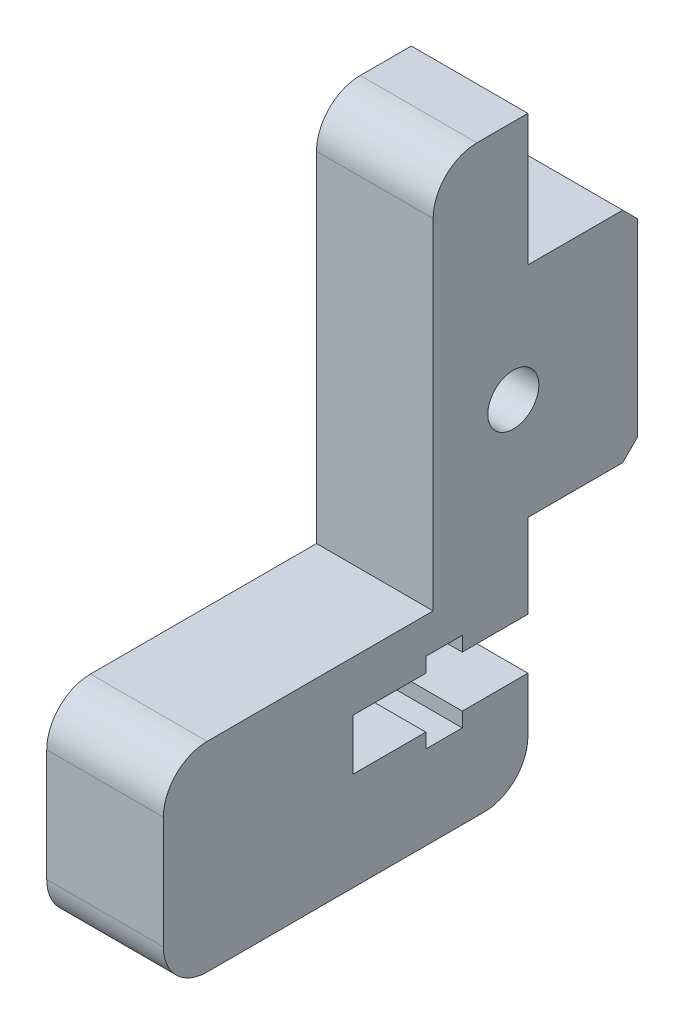
ISO-10303-21;
HEADER;
FILE_DESCRIPTION(('STEP AP214'),'2;1');
FILE_NAME('part.step','',(''),(''),'','','');
FILE_SCHEMA(('AUTOMOTIVE_DESIGN { 1 0 10303 214 1 1 1 1 }'));
ENDSEC;
DATA;
#1=APPLICATION_CONTEXT('core data for automotive mechanical design processes');
#2=APPLICATION_PROTOCOL_DEFINITION('international standard','automotive_design',2000,#1);
#3=PRODUCT_CONTEXT('',#1,'mechanical');
#4=PRODUCT('Part','Part','',(#3));
#5=PRODUCT_RELATED_PRODUCT_CATEGORY('part','',(#4));
#6=PRODUCT_DEFINITION_FORMATION('','',#4);
#7=PRODUCT_DEFINITION_CONTEXT('part definition',#1,'design');
#8=PRODUCT_DEFINITION('design','',#6,#7);
#9=PRODUCT_DEFINITION_SHAPE('','',#8);
#10=(LENGTH_UNIT() NAMED_UNIT(*) SI_UNIT(.MILLI.,.METRE.));
#11=(NAMED_UNIT(*) PLANE_ANGLE_UNIT() SI_UNIT($,.RADIAN.));
#12=(NAMED_UNIT(*) SI_UNIT($,.STERADIAN.) SOLID_ANGLE_UNIT());
#13=UNCERTAINTY_MEASURE_WITH_UNIT(LENGTH_MEASURE(1.E-05),#10,'distance_accuracy_value','');
#14=(GEOMETRIC_REPRESENTATION_CONTEXT(3) GLOBAL_UNCERTAINTY_ASSIGNED_CONTEXT((#13)) GLOBAL_UNIT_ASSIGNED_CONTEXT((#10,
#11,#12)) REPRESENTATION_CONTEXT('',''));
#15=CARTESIAN_POINT('',(0.,0.,0.));
#16=DIRECTION('',(0.,0.,1.));
#17=DIRECTION('',(1.,0.,0.));
#18=AXIS2_PLACEMENT_3D('',#15,#16,#17);
#19=CARTESIAN_POINT('',(8.,40.0972170023576,-24.582940187531));
#20=DIRECTION('',(1.,0.,0.));
#21=DIRECTION('',(0.,0.,-1.));
#22=AXIS2_PLACEMENT_3D('',#19,#20,#21);
#23=PLANE('',#22);
#24=DIRECTION('',(0.,1.,0.));
#25=VECTOR('',#24,1.);
#26=CARTESIAN_POINT('',(8.,13.3472170023576,-28.082940187531));
#27=LINE('',#26,#25);
#28=CARTESIAN_POINT('',(8.,13.3472170023576,-28.082940187531));
#29=VERTEX_POINT('',#28);
#30=CARTESIAN_POINT('',(8.,19.0972170023576,-28.082940187531));
#31=VERTEX_POINT('',#30);
#32=EDGE_CURVE('E309',#29,#31,#27,.T.);
#33=ORIENTED_EDGE('',*,*,#32,.T.);
#34=DIRECTION('',(0.,0.,-1.));
#35=VECTOR('',#34,1.);
#36=CARTESIAN_POINT('',(8.,19.0972170023576,-28.082940187531));
#37=LINE('',#36,#35);
#38=CARTESIAN_POINT('',(8.,19.0972170023576,-34.582940187531));
#39=VERTEX_POINT('',#38);
#40=EDGE_CURVE('E157',#31,#39,#37,.T.);
#41=ORIENTED_EDGE('',*,*,#40,.T.);
#42=DIRECTION('',(0.,0.707106781186549,-0.707106781186546));
#43=VECTOR('',#42,1.);
#44=CARTESIAN_POINT('',(8.,19.0972170023576,-34.582940187531));
#45=LINE('',#44,#43);
#46=CARTESIAN_POINT('',(8.,20.0972170023576,-35.582940187531));
#47=VERTEX_POINT('',#46);
#48=EDGE_CURVE('E384',#39,#47,#45,.T.);
#49=ORIENTED_EDGE('',*,*,#48,.T.);
#50=DIRECTION('',(0.,1.,0.));
#51=VECTOR('',#50,1.);
#52=CARTESIAN_POINT('',(8.,20.0972170023576,-35.582940187531));
#53=LINE('',#52,#51);
#54=CARTESIAN_POINT('',(8.,33.0972170023576,-35.582940187531));
#55=VERTEX_POINT('',#54);
#56=EDGE_CURVE('E403',#47,#55,#53,.T.);
#57=ORIENTED_EDGE('',*,*,#56,.T.);
#58=DIRECTION('',(0.,0.707106781186547,0.707106781186547));
#59=VECTOR('',#58,1.);
#60=CARTESIAN_POINT('',(8.,33.0972170023576,-35.582940187531));
#61=LINE('',#60,#59);
#62=CARTESIAN_POINT('',(8.,34.0972170023576,-34.582940187531));
#63=VERTEX_POINT('',#62);
#64=EDGE_CURVE('E400',#55,#63,#61,.T.);
#65=ORIENTED_EDGE('',*,*,#64,.T.);
#66=DIRECTION('',(0.,0.,1.));
#67=VECTOR('',#66,1.);
#68=CARTESIAN_POINT('',(8.,34.0972170023576,-34.582940187531));
#69=LINE('',#68,#67);
#70=CARTESIAN_POINT('',(8.,34.0972170023576,-28.082940187531));
#71=VERTEX_POINT('',#70);
#72=EDGE_CURVE('E402',#63,#71,#69,.T.);
#73=ORIENTED_EDGE('',*,*,#72,.T.);
#74=DIRECTION('',(0.,1.,0.));
#75=VECTOR('',#74,1.);
#76=CARTESIAN_POINT('',(8.,34.0972170023576,-28.082940187531));
#77=LINE('',#76,#75);
#78=CARTESIAN_POINT('',(8.,43.0972170023576,-28.082940187531));
#79=VERTEX_POINT('',#78);
#80=EDGE_CURVE('E405',#71,#79,#77,.T.);
#81=ORIENTED_EDGE('',*,*,#80,.T.);
#82=DIRECTION('',(0.,0.,1.));
#83=VECTOR('',#82,1.);
#84=CARTESIAN_POINT('',(8.,43.0972170023576,-28.082940187531));
#85=LINE('',#84,#83);
#86=CARTESIAN_POINT('',(8.,43.0972170023576,-24.582940187531));
#87=VERTEX_POINT('',#86);
#88=EDGE_CURVE('E411',#79,#87,#85,.T.);
#89=ORIENTED_EDGE('',*,*,#88,.T.);
#90=CARTESIAN_POINT('',(8.,40.0972170023576,-24.582940187531));
#91=DIRECTION('',(1.,0.,0.));
#92=DIRECTION('',(0.,0.,-1.));
#93=AXIS2_PLACEMENT_3D('',#90,#91,#92);
#94=CIRCLE('',#93,3.);
#95=CARTESIAN_POINT('',(8.,40.0972170023576,-21.582940187531));
#96=VERTEX_POINT('',#95);
#97=EDGE_CURVE('E413',#87,#96,#94,.T.);
#98=ORIENTED_EDGE('',*,*,#97,.T.);
#99=DIRECTION('',(0.,-1.,0.));
#100=VECTOR('',#99,1.);
#101=CARTESIAN_POINT('',(8.,40.0972170023576,-21.582940187531));
#102=LINE('',#101,#100);
#103=CARTESIAN_POINT('',(8.,16.7972170023578,-21.582940187531));
#104=VERTEX_POINT('',#103);
#105=EDGE_CURVE('E415',#96,#104,#102,.T.);
#106=ORIENTED_EDGE('',*,*,#105,.T.);
#107=DIRECTION('',(0.,0.,1.));
#108=VECTOR('',#107,1.);
#109=CARTESIAN_POINT('',(8.,16.7972170023578,-21.582940187531));
#110=LINE('',#109,#108);
#111=CARTESIAN_POINT('',(8.,16.7972170023578,-6.08294018753095));
#112=VERTEX_POINT('',#111);
#113=EDGE_CURVE('E417',#104,#112,#110,.T.);
#114=ORIENTED_EDGE('',*,*,#113,.T.);
#115=CARTESIAN_POINT('',(8.,13.7972170023578,-6.08294018753095));
#116=DIRECTION('',(1.,0.,0.));
#117=DIRECTION('',(0.,0.,-1.));
#118=AXIS2_PLACEMENT_3D('',#115,#116,#117);
#119=CIRCLE('',#118,3.);
#120=CARTESIAN_POINT('',(8.,13.7972170023578,-3.08294018753095));
#121=VERTEX_POINT('',#120);
#122=EDGE_CURVE('E419',#112,#121,#119,.T.);
#123=ORIENTED_EDGE('',*,*,#122,.T.);
#124=DIRECTION('',(0.,-1.,0.));
#125=VECTOR('',#124,1.);
#126=CARTESIAN_POINT('',(8.,13.7972170023578,-3.08294018753095));
#127=LINE('',#126,#125);
#128=CARTESIAN_POINT('',(8.,6.09721700235757,-3.08294018753095));
#129=VERTEX_POINT('',#128);
#130=EDGE_CURVE('E421',#121,#129,#127,.T.);
#131=ORIENTED_EDGE('',*,*,#130,.T.);
#132=CARTESIAN_POINT('',(8.,6.09721700235758,-6.08294018753095));
#133=DIRECTION('',(1.,0.,0.));
#134=DIRECTION('',(0.,0.,-1.));
#135=AXIS2_PLACEMENT_3D('',#132,#133,#134);
#136=CIRCLE('',#135,3.);
#137=CARTESIAN_POINT('',(8.,3.09721700235757,-6.08294018753095));
#138=VERTEX_POINT('',#137);
#139=EDGE_CURVE('E423',#129,#138,#136,.T.);
#140=ORIENTED_EDGE('',*,*,#139,.T.);
#141=DIRECTION('',(0.,0.,-1.));
#142=VECTOR('',#141,1.);
#143=CARTESIAN_POINT('',(8.,3.09721700235757,-6.08294018753095));
#144=LINE('',#143,#142);
#145=CARTESIAN_POINT('',(8.,3.09721700235757,-25.082940187531));
#146=VERTEX_POINT('',#145);
#147=EDGE_CURVE('E425',#138,#146,#144,.T.);
#148=ORIENTED_EDGE('',*,*,#147,.T.);
#149=CARTESIAN_POINT('',(8.,6.09721700235758,-25.082940187531));
#150=DIRECTION('',(1.,0.,0.));
#151=DIRECTION('',(0.,0.,-1.));
#152=AXIS2_PLACEMENT_3D('',#149,#150,#151);
#153=CIRCLE('',#152,3.);
#154=CARTESIAN_POINT('',(8.,6.09721700235757,-28.082940187531));
#155=VERTEX_POINT('',#154);
#156=EDGE_CURVE('E427',#146,#155,#153,.T.);
#157=ORIENTED_EDGE('',*,*,#156,.T.);
#158=DIRECTION('',(0.,1.,0.));
#159=VECTOR('',#158,1.);
#160=CARTESIAN_POINT('',(8.,6.09721700235757,-28.082940187531));
#161=LINE('',#160,#159);
#162=CARTESIAN_POINT('',(8.,9.84721700235757,-28.082940187531));
#163=VERTEX_POINT('',#162);
#164=EDGE_CURVE('E429',#155,#163,#161,.T.);
#165=ORIENTED_EDGE('',*,*,#164,.T.);
#166=DIRECTION('',(0.,0.,1.));
#167=VECTOR('',#166,1.);
#168=CARTESIAN_POINT('',(8.,9.84721700235757,-28.082940187531));
#169=LINE('',#168,#167);
#170=CARTESIAN_POINT('',(8.,9.84721700235757,-23.582940187531));
#171=VERTEX_POINT('',#170);
#172=EDGE_CURVE('E431',#163,#171,#169,.T.);
#173=ORIENTED_EDGE('',*,*,#172,.T.);
#174=DIRECTION('',(0.,-1.,0.));
#175=VECTOR('',#174,1.);
#176=CARTESIAN_POINT('',(8.,9.84721700235757,-23.582940187531));
#177=LINE('',#176,#175);
#178=CARTESIAN_POINT('',(8.,8.84721700235758,-23.582940187531));
#179=VERTEX_POINT('',#178);
#180=EDGE_CURVE('E433',#171,#179,#177,.T.);
#181=ORIENTED_EDGE('',*,*,#180,.T.);
#182=DIRECTION('',(0.,0.,1.));
#183=VECTOR('',#182,1.);
#184=CARTESIAN_POINT('',(8.,8.84721700235758,-23.582940187531));
#185=LINE('',#184,#183);
#186=CARTESIAN_POINT('',(8.,8.84721700235758,-21.082940187531));
#187=VERTEX_POINT('',#186);
#188=EDGE_CURVE('E435',#179,#187,#185,.T.);
#189=ORIENTED_EDGE('',*,*,#188,.T.);
#190=DIRECTION('',(0.,1.,0.));
#191=VECTOR('',#190,1.);
#192=CARTESIAN_POINT('',(8.,8.84721700235758,-21.082940187531));
#193=LINE('',#192,#191);
#194=CARTESIAN_POINT('',(8.,9.84721700235757,-21.082940187531));
#195=VERTEX_POINT('',#194);
#196=EDGE_CURVE('E437',#187,#195,#193,.T.);
#197=ORIENTED_EDGE('',*,*,#196,.T.);
#198=DIRECTION('',(0.,0.,1.));
#199=VECTOR('',#198,1.);
#200=CARTESIAN_POINT('',(8.,9.84721700235757,-21.082940187531));
#201=LINE('',#200,#199);
#202=CARTESIAN_POINT('',(8.,9.84721700235757,-16.082940187531));
#203=VERTEX_POINT('',#202);
#204=EDGE_CURVE('E439',#195,#203,#201,.T.);
#205=ORIENTED_EDGE('',*,*,#204,.T.);
#206=DIRECTION('',(0.,1.,0.));
#207=VECTOR('',#206,1.);
#208=CARTESIAN_POINT('',(8.,9.84721700235757,-16.082940187531));
#209=LINE('',#208,#207);
#210=CARTESIAN_POINT('',(8.,13.3472170023576,-16.082940187531));
#211=VERTEX_POINT('',#210);
#212=EDGE_CURVE('E441',#203,#211,#209,.T.);
#213=ORIENTED_EDGE('',*,*,#212,.T.);
#214=DIRECTION('',(0.,0.,-1.));
#215=VECTOR('',#214,1.);
#216=CARTESIAN_POINT('',(8.,13.3472170023576,-16.082940187531));
#217=LINE('',#216,#215);
#218=CARTESIAN_POINT('',(8.,13.3472170023576,-21.082940187531));
#219=VERTEX_POINT('',#218);
#220=EDGE_CURVE('E443',#211,#219,#217,.T.);
#221=ORIENTED_EDGE('',*,*,#220,.T.);
#222=DIRECTION('',(0.,1.,0.));
#223=VECTOR('',#222,1.);
#224=CARTESIAN_POINT('',(8.,13.3472170023576,-21.082940187531));
#225=LINE('',#224,#223);
#226=CARTESIAN_POINT('',(8.,14.3472170023576,-21.082940187531));
#227=VERTEX_POINT('',#226);
#228=EDGE_CURVE('E236',#219,#227,#225,.T.);
#229=ORIENTED_EDGE('',*,*,#228,.T.);
#230=DIRECTION('',(0.,0.,-1.));
#231=VECTOR('',#230,1.);
#232=CARTESIAN_POINT('',(8.,14.3472170023576,-21.082940187531));
#233=LINE('',#232,#231);
#234=CARTESIAN_POINT('',(8.,14.3472170023576,-23.582940187531));
#235=VERTEX_POINT('',#234);
#236=EDGE_CURVE('E230',#227,#235,#233,.T.);
#237=ORIENTED_EDGE('',*,*,#236,.T.);
#238=DIRECTION('',(0.,-1.,0.));
#239=VECTOR('',#238,1.);
#240=CARTESIAN_POINT('',(8.,14.3472170023576,-23.582940187531));
#241=LINE('',#240,#239);
#242=CARTESIAN_POINT('',(8.,13.3472170023576,-23.582940187531));
#243=VERTEX_POINT('',#242);
#244=EDGE_CURVE('E234',#235,#243,#241,.T.);
#245=ORIENTED_EDGE('',*,*,#244,.T.);
#246=DIRECTION('',(0.,0.,-1.));
#247=VECTOR('',#246,1.);
#248=CARTESIAN_POINT('',(8.,13.3472170023576,-23.582940187531));
#249=LINE('',#248,#247);
#250=EDGE_CURVE('E54',#243,#29,#249,.T.);
#251=ORIENTED_EDGE('',*,*,#250,.T.);
#252=EDGE_LOOP('',(#33,#41,#49,#57,#65,#73,#81,#89,#98,#106,#114,#123,#131,#140,#148,#157,#165,
#173,#181,#189,#197,#205,#213,#221,#229,#237,#245,#251));
#253=FACE_BOUND('',#252,.T.);
#254=CARTESIAN_POINT('',(8.,26.5972170023576,-27.082940187531));
#255=DIRECTION('',(1.,0.,0.));
#256=DIRECTION('',(0.,0.,-1.));
#257=AXIS2_PLACEMENT_3D('',#254,#255,#256);
#258=CIRCLE('',#257,1.75);
#259=CARTESIAN_POINT('',(8.,26.5972170023576,-28.832940187531));
#260=VERTEX_POINT('',#259);
#261=EDGE_CURVE('E258',#260,#260,#258,.T.);
#262=ORIENTED_EDGE('',*,*,#261,.F.);
#263=EDGE_LOOP('',(#262));
#264=FACE_BOUND('',#263,.T.);
#265=ADVANCED_FACE('F37',(#253,#264),#23,.T.);
#266=CARTESIAN_POINT('',(0.,40.0972170023576,-24.582940187531));
#267=DIRECTION('',(1.,0.,0.));
#268=DIRECTION('',(0.,0.,-1.));
#269=AXIS2_PLACEMENT_3D('',#266,#267,#268);
#270=PLANE('',#269);
#271=DIRECTION('',(0.,1.,0.));
#272=VECTOR('',#271,1.);
#273=CARTESIAN_POINT('',(0.,13.3472170023576,-28.082940187531));
#274=LINE('',#273,#272);
#275=CARTESIAN_POINT('',(0.,13.3472170023576,-28.082940187531));
#276=VERTEX_POINT('',#275);
#277=CARTESIAN_POINT('',(0.,19.0972170023576,-28.082940187531));
#278=VERTEX_POINT('',#277);
#279=EDGE_CURVE('E254',#276,#278,#274,.T.);
#280=ORIENTED_EDGE('',*,*,#279,.F.);
#281=DIRECTION('',(0.,0.,-1.));
#282=VECTOR('',#281,1.);
#283=CARTESIAN_POINT('',(0.,13.3472170023576,-23.582940187531));
#284=LINE('',#283,#282);
#285=CARTESIAN_POINT('',(0.,13.3472170023576,-23.582940187531));
#286=VERTEX_POINT('',#285);
#287=EDGE_CURVE('E149',#286,#276,#284,.T.);
#288=ORIENTED_EDGE('',*,*,#287,.F.);
#289=DIRECTION('',(0.,-1.,0.));
#290=VECTOR('',#289,1.);
#291=CARTESIAN_POINT('',(0.,14.3472170023576,-23.582940187531));
#292=LINE('',#291,#290);
#293=CARTESIAN_POINT('',(0.,14.3472170023576,-23.582940187531));
#294=VERTEX_POINT('',#293);
#295=EDGE_CURVE('E143',#294,#286,#292,.T.);
#296=ORIENTED_EDGE('',*,*,#295,.F.);
#297=DIRECTION('',(0.,0.,-1.));
#298=VECTOR('',#297,1.);
#299=CARTESIAN_POINT('',(0.,14.3472170023576,-21.082940187531));
#300=LINE('',#299,#298);
#301=CARTESIAN_POINT('',(0.,14.3472170023576,-21.082940187531));
#302=VERTEX_POINT('',#301);
#303=EDGE_CURVE('E244',#302,#294,#300,.T.);
#304=ORIENTED_EDGE('',*,*,#303,.F.);
#305=DIRECTION('',(0.,1.,0.));
#306=VECTOR('',#305,1.);
#307=CARTESIAN_POINT('',(0.,13.3472170023576,-21.082940187531));
#308=LINE('',#307,#306);
#309=CARTESIAN_POINT('',(0.,13.3472170023576,-21.082940187531));
#310=VERTEX_POINT('',#309);
#311=EDGE_CURVE('E304',#310,#302,#308,.T.);
#312=ORIENTED_EDGE('',*,*,#311,.F.);
#313=DIRECTION('',(0.,0.,-1.));
#314=VECTOR('',#313,1.);
#315=CARTESIAN_POINT('',(0.,13.3472170023576,-16.082940187531));
#316=LINE('',#315,#314);
#317=CARTESIAN_POINT('',(0.,13.3472170023576,-16.082940187531));
#318=VERTEX_POINT('',#317);
#319=EDGE_CURVE('E302',#318,#310,#316,.T.);
#320=ORIENTED_EDGE('',*,*,#319,.F.);
#321=DIRECTION('',(0.,1.,0.));
#322=VECTOR('',#321,1.);
#323=CARTESIAN_POINT('',(0.,9.84721700235757,-16.082940187531));
#324=LINE('',#323,#322);
#325=CARTESIAN_POINT('',(0.,9.84721700235757,-16.082940187531));
#326=VERTEX_POINT('',#325);
#327=EDGE_CURVE('E300',#326,#318,#324,.T.);
#328=ORIENTED_EDGE('',*,*,#327,.F.);
#329=DIRECTION('',(0.,0.,1.));
#330=VECTOR('',#329,1.);
#331=CARTESIAN_POINT('',(0.,9.84721700235757,-21.082940187531));
#332=LINE('',#331,#330);
#333=CARTESIAN_POINT('',(0.,9.84721700235757,-21.082940187531));
#334=VERTEX_POINT('',#333);
#335=EDGE_CURVE('E298',#334,#326,#332,.T.);
#336=ORIENTED_EDGE('',*,*,#335,.F.);
#337=DIRECTION('',(0.,1.,0.));
#338=VECTOR('',#337,1.);
#339=CARTESIAN_POINT('',(0.,8.84721700235758,-21.082940187531));
#340=LINE('',#339,#338);
#341=CARTESIAN_POINT('',(0.,8.84721700235758,-21.082940187531));
#342=VERTEX_POINT('',#341);
#343=EDGE_CURVE('E296',#342,#334,#340,.T.);
#344=ORIENTED_EDGE('',*,*,#343,.F.);
#345=DIRECTION('',(0.,0.,1.));
#346=VECTOR('',#345,1.);
#347=CARTESIAN_POINT('',(0.,8.84721700235758,-23.582940187531));
#348=LINE('',#347,#346);
#349=CARTESIAN_POINT('',(0.,8.84721700235758,-23.582940187531));
#350=VERTEX_POINT('',#349);
#351=EDGE_CURVE('E294',#350,#342,#348,.T.);
#352=ORIENTED_EDGE('',*,*,#351,.F.);
#353=DIRECTION('',(0.,-1.,0.));
#354=VECTOR('',#353,1.);
#355=CARTESIAN_POINT('',(0.,9.84721700235757,-23.582940187531));
#356=LINE('',#355,#354);
#357=CARTESIAN_POINT('',(0.,9.84721700235757,-23.582940187531));
#358=VERTEX_POINT('',#357);
#359=EDGE_CURVE('E292',#358,#350,#356,.T.);
#360=ORIENTED_EDGE('',*,*,#359,.F.);
#361=DIRECTION('',(0.,0.,1.));
#362=VECTOR('',#361,1.);
#363=CARTESIAN_POINT('',(0.,9.84721700235757,-28.082940187531));
#364=LINE('',#363,#362);
#365=CARTESIAN_POINT('',(0.,9.84721700235757,-28.082940187531));
#366=VERTEX_POINT('',#365);
#367=EDGE_CURVE('E290',#366,#358,#364,.T.);
#368=ORIENTED_EDGE('',*,*,#367,.F.);
#369=DIRECTION('',(0.,1.,0.));
#370=VECTOR('',#369,1.);
#371=CARTESIAN_POINT('',(0.,6.09721700235757,-28.082940187531));
#372=LINE('',#371,#370);
#373=CARTESIAN_POINT('',(0.,6.09721700235757,-28.082940187531));
#374=VERTEX_POINT('',#373);
#375=EDGE_CURVE('E288',#374,#366,#372,.T.);
#376=ORIENTED_EDGE('',*,*,#375,.F.);
#377=CARTESIAN_POINT('',(0.,6.09721700235758,-25.082940187531));
#378=DIRECTION('',(1.,0.,0.));
#379=DIRECTION('',(0.,0.,-1.));
#380=AXIS2_PLACEMENT_3D('',#377,#378,#379);
#381=CIRCLE('',#380,3.);
#382=CARTESIAN_POINT('',(0.,3.09721700235757,-25.082940187531));
#383=VERTEX_POINT('',#382);
#384=EDGE_CURVE('E286',#383,#374,#381,.T.);
#385=ORIENTED_EDGE('',*,*,#384,.F.);
#386=DIRECTION('',(0.,0.,-1.));
#387=VECTOR('',#386,1.);
#388=CARTESIAN_POINT('',(0.,3.09721700235757,-6.08294018753095));
#389=LINE('',#388,#387);
#390=CARTESIAN_POINT('',(0.,3.09721700235757,-6.08294018753095));
#391=VERTEX_POINT('',#390);
#392=EDGE_CURVE('E284',#391,#383,#389,.T.);
#393=ORIENTED_EDGE('',*,*,#392,.F.);
#394=CARTESIAN_POINT('',(0.,6.09721700235758,-6.08294018753095));
#395=DIRECTION('',(1.,0.,0.));
#396=DIRECTION('',(0.,0.,-1.));
#397=AXIS2_PLACEMENT_3D('',#394,#395,#396);
#398=CIRCLE('',#397,3.);
#399=CARTESIAN_POINT('',(0.,6.09721700235757,-3.08294018753095));
#400=VERTEX_POINT('',#399);
#401=EDGE_CURVE('E282',#400,#391,#398,.T.);
#402=ORIENTED_EDGE('',*,*,#401,.F.);
#403=DIRECTION('',(0.,-1.,0.));
#404=VECTOR('',#403,1.);
#405=CARTESIAN_POINT('',(0.,13.7972170023578,-3.08294018753095));
#406=LINE('',#405,#404);
#407=CARTESIAN_POINT('',(0.,13.7972170023578,-3.08294018753095));
#408=VERTEX_POINT('',#407);
#409=EDGE_CURVE('E280',#408,#400,#406,.T.);
#410=ORIENTED_EDGE('',*,*,#409,.F.);
#411=CARTESIAN_POINT('',(0.,13.7972170023578,-6.08294018753095));
#412=DIRECTION('',(1.,0.,0.));
#413=DIRECTION('',(0.,0.,-1.));
#414=AXIS2_PLACEMENT_3D('',#411,#412,#413);
#415=CIRCLE('',#414,3.);
#416=CARTESIAN_POINT('',(0.,16.7972170023578,-6.08294018753095));
#417=VERTEX_POINT('',#416);
#418=EDGE_CURVE('E278',#417,#408,#415,.T.);
#419=ORIENTED_EDGE('',*,*,#418,.F.);
#420=DIRECTION('',(0.,0.,1.));
#421=VECTOR('',#420,1.);
#422=CARTESIAN_POINT('',(0.,16.7972170023578,-21.582940187531));
#423=LINE('',#422,#421);
#424=CARTESIAN_POINT('',(0.,16.7972170023578,-21.582940187531));
#425=VERTEX_POINT('',#424);
#426=EDGE_CURVE('E276',#425,#417,#423,.T.);
#427=ORIENTED_EDGE('',*,*,#426,.F.);
#428=DIRECTION('',(0.,-1.,0.));
#429=VECTOR('',#428,1.);
#430=CARTESIAN_POINT('',(0.,40.0972170023576,-21.582940187531));
#431=LINE('',#430,#429);
#432=CARTESIAN_POINT('',(0.,40.0972170023576,-21.582940187531));
#433=VERTEX_POINT('',#432);
#434=EDGE_CURVE('E274',#433,#425,#431,.T.);
#435=ORIENTED_EDGE('',*,*,#434,.F.);
#436=CARTESIAN_POINT('',(0.,40.0972170023576,-24.582940187531));
#437=DIRECTION('',(1.,0.,0.));
#438=DIRECTION('',(0.,0.,-1.));
#439=AXIS2_PLACEMENT_3D('',#436,#437,#438);
#440=CIRCLE('',#439,3.);
#441=CARTESIAN_POINT('',(0.,43.0972170023576,-24.582940187531));
#442=VERTEX_POINT('',#441);
#443=EDGE_CURVE('E272',#442,#433,#440,.T.);
#444=ORIENTED_EDGE('',*,*,#443,.F.);
#445=DIRECTION('',(0.,0.,1.));
#446=VECTOR('',#445,1.);
#447=CARTESIAN_POINT('',(0.,43.0972170023576,-28.082940187531));
#448=LINE('',#447,#446);
#449=CARTESIAN_POINT('',(0.,43.0972170023576,-28.082940187531));
#450=VERTEX_POINT('',#449);
#451=EDGE_CURVE('E270',#450,#442,#448,.T.);
#452=ORIENTED_EDGE('',*,*,#451,.F.);
#453=DIRECTION('',(0.,1.,0.));
#454=VECTOR('',#453,1.);
#455=CARTESIAN_POINT('',(0.,34.0972170023576,-28.082940187531));
#456=LINE('',#455,#454);
#457=CARTESIAN_POINT('',(0.,34.0972170023576,-28.082940187531));
#458=VERTEX_POINT('',#457);
#459=EDGE_CURVE('E268',#458,#450,#456,.T.);
#460=ORIENTED_EDGE('',*,*,#459,.F.);
#461=DIRECTION('',(0.,0.,1.));
#462=VECTOR('',#461,1.);
#463=CARTESIAN_POINT('',(0.,34.0972170023576,-34.582940187531));
#464=LINE('',#463,#462);
#465=CARTESIAN_POINT('',(0.,34.0972170023576,-34.582940187531));
#466=VERTEX_POINT('',#465);
#467=EDGE_CURVE('E266',#466,#458,#464,.T.);
#468=ORIENTED_EDGE('',*,*,#467,.F.);
#469=DIRECTION('',(0.,0.707106781186547,0.707106781186547));
#470=VECTOR('',#469,1.);
#471=CARTESIAN_POINT('',(0.,33.0972170023576,-35.582940187531));
#472=LINE('',#471,#470);
#473=CARTESIAN_POINT('',(0.,33.0972170023576,-35.582940187531));
#474=VERTEX_POINT('',#473);
#475=EDGE_CURVE('E264',#474,#466,#472,.T.);
#476=ORIENTED_EDGE('',*,*,#475,.F.);
#477=DIRECTION('',(0.,1.,0.));
#478=VECTOR('',#477,1.);
#479=CARTESIAN_POINT('',(0.,20.0972170023576,-35.582940187531));
#480=LINE('',#479,#478);
#481=CARTESIAN_POINT('',(0.,20.0972170023576,-35.582940187531));
#482=VERTEX_POINT('',#481);
#483=EDGE_CURVE('E262',#482,#474,#480,.T.);
#484=ORIENTED_EDGE('',*,*,#483,.F.);
#485=DIRECTION('',(0.,0.707106781186549,-0.707106781186546));
#486=VECTOR('',#485,1.);
#487=CARTESIAN_POINT('',(0.,19.0972170023576,-34.582940187531));
#488=LINE('',#487,#486);
#489=CARTESIAN_POINT('',(0.,19.0972170023576,-34.582940187531));
#490=VERTEX_POINT('',#489);
#491=EDGE_CURVE('E260',#490,#482,#488,.T.);
#492=ORIENTED_EDGE('',*,*,#491,.F.);
#493=DIRECTION('',(0.,0.,-1.));
#494=VECTOR('',#493,1.);
#495=CARTESIAN_POINT('',(0.,19.0972170023576,-28.082940187531));
#496=LINE('',#495,#494);
#497=EDGE_CURVE('E257',#278,#490,#496,.T.);
#498=ORIENTED_EDGE('',*,*,#497,.F.);
#499=EDGE_LOOP('',(#280,#288,#296,#304,#312,#320,#328,#336,#344,#352,#360,#368,#376,#385,#393,
#402,#410,#419,#427,#435,#444,#452,#460,#468,#476,#484,#492,#498));
#500=FACE_BOUND('',#499,.T.);
#501=CARTESIAN_POINT('',(0.,26.5972170023576,-27.082940187531));
#502=DIRECTION('',(1.,0.,0.));
#503=DIRECTION('',(0.,0.,-1.));
#504=AXIS2_PLACEMENT_3D('',#501,#502,#503);
#505=CIRCLE('',#504,1.75);
#506=CARTESIAN_POINT('',(0.,26.5972170023576,-28.832940187531));
#507=VERTEX_POINT('',#506);
#508=EDGE_CURVE('E487',#507,#507,#505,.T.);
#509=ORIENTED_EDGE('',*,*,#508,.T.);
#510=EDGE_LOOP('',(#509));
#511=FACE_BOUND('',#510,.T.);
#512=ADVANCED_FACE('F388',(#500,#511),#270,.F.);
#513=CARTESIAN_POINT('',(8.,13.3472170023576,-28.082940187531));
#514=DIRECTION('',(0.,0.,1.));
#515=DIRECTION('',(1.,0.,0.));
#516=AXIS2_PLACEMENT_3D('',#513,#514,#515);
#517=PLANE('',#516);
#518=ORIENTED_EDGE('',*,*,#279,.T.);
#519=DIRECTION('',(-1.,0.,0.));
#520=VECTOR('',#519,1.);
#521=CARTESIAN_POINT('',(8.,19.0972170023576,-28.082940187531));
#522=LINE('',#521,#520);
#523=EDGE_CURVE('E11',#31,#278,#522,.T.);
#524=ORIENTED_EDGE('',*,*,#523,.F.);
#525=ORIENTED_EDGE('',*,*,#32,.F.);
#526=DIRECTION('',(-1.,0.,0.));
#527=VECTOR('',#526,1.);
#528=CARTESIAN_POINT('',(8.,13.3472170023576,-28.082940187531));
#529=LINE('',#528,#527);
#530=EDGE_CURVE('E250',#29,#276,#529,.T.);
#531=ORIENTED_EDGE('',*,*,#530,.T.);
#532=EDGE_LOOP('',(#518,#524,#525,#531));
#533=FACE_BOUND('',#532,.T.);
#534=ADVANCED_FACE('F39',(#533),#517,.F.);
#535=CARTESIAN_POINT('',(8.,19.0972170023576,-28.082940187531));
#536=DIRECTION('',(0.,1.,0.));
#537=DIRECTION('',(0.,0.,1.));
#538=AXIS2_PLACEMENT_3D('',#535,#536,#537);
#539=PLANE('',#538);
#540=ORIENTED_EDGE('',*,*,#497,.T.);
#541=DIRECTION('',(-1.,0.,0.));
#542=VECTOR('',#541,1.);
#543=CARTESIAN_POINT('',(8.,19.0972170023576,-34.582940187531));
#544=LINE('',#543,#542);
#545=EDGE_CURVE('E46',#39,#490,#544,.T.);
#546=ORIENTED_EDGE('',*,*,#545,.F.);
#547=ORIENTED_EDGE('',*,*,#40,.F.);
#548=ORIENTED_EDGE('',*,*,#523,.T.);
#549=EDGE_LOOP('',(#540,#546,#547,#548));
#550=FACE_BOUND('',#549,.T.);
#551=ADVANCED_FACE('F605',(#550),#539,.F.);
#552=CARTESIAN_POINT('',(8.,19.0972170023576,-34.582940187531));
#553=DIRECTION('',(0.,0.707106781186546,0.707106781186549));
#554=DIRECTION('',(0.,-0.707106781186549,0.707106781186546));
#555=AXIS2_PLACEMENT_3D('',#552,#553,#554);
#556=PLANE('',#555);
#557=ORIENTED_EDGE('',*,*,#491,.T.);
#558=DIRECTION('',(-1.,0.,0.));
#559=VECTOR('',#558,1.);
#560=CARTESIAN_POINT('',(8.,20.0972170023576,-35.582940187531));
#561=LINE('',#560,#559);
#562=EDGE_CURVE('E376',#47,#482,#561,.T.);
#563=ORIENTED_EDGE('',*,*,#562,.F.);
#564=ORIENTED_EDGE('',*,*,#48,.F.);
#565=ORIENTED_EDGE('',*,*,#545,.T.);
#566=EDGE_LOOP('',(#557,#563,#564,#565));
#567=FACE_BOUND('',#566,.T.);
#568=ADVANCED_FACE('F382',(#567),#556,.F.);
#569=CARTESIAN_POINT('',(8.,20.0972170023576,-35.582940187531));
#570=DIRECTION('',(0.,0.,1.));
#571=DIRECTION('',(1.,0.,0.));
#572=AXIS2_PLACEMENT_3D('',#569,#570,#571);
#573=PLANE('',#572);
#574=ORIENTED_EDGE('',*,*,#483,.T.);
#575=DIRECTION('',(-1.,0.,0.));
#576=VECTOR('',#575,1.);
#577=CARTESIAN_POINT('',(8.,33.0972170023576,-35.582940187531));
#578=LINE('',#577,#576);
#579=EDGE_CURVE('E373',#55,#474,#578,.T.);
#580=ORIENTED_EDGE('',*,*,#579,.F.);
#581=ORIENTED_EDGE('',*,*,#56,.F.);
#582=ORIENTED_EDGE('',*,*,#562,.T.);
#583=EDGE_LOOP('',(#574,#580,#581,#582));
#584=FACE_BOUND('',#583,.T.);
#585=ADVANCED_FACE('F394',(#584),#573,.F.);
#586=CARTESIAN_POINT('',(8.,33.0972170023576,-35.582940187531));
#587=DIRECTION('',(0.,-0.707106781186547,0.707106781186547));
#588=DIRECTION('',(0.,-0.707106781186548,-0.707106781186548));
#589=AXIS2_PLACEMENT_3D('',#586,#587,#588);
#590=PLANE('',#589);
#591=ORIENTED_EDGE('',*,*,#475,.T.);
#592=DIRECTION('',(-1.,0.,0.));
#593=VECTOR('',#592,1.);
#594=CARTESIAN_POINT('',(8.,34.0972170023576,-34.582940187531));
#595=LINE('',#594,#593);
#596=EDGE_CURVE('E370',#63,#466,#595,.T.);
#597=ORIENTED_EDGE('',*,*,#596,.F.);
#598=ORIENTED_EDGE('',*,*,#64,.F.);
#599=ORIENTED_EDGE('',*,*,#579,.T.);
#600=EDGE_LOOP('',(#591,#597,#598,#599));
#601=FACE_BOUND('',#600,.T.);
#602=ADVANCED_FACE('F398',(#601),#590,.F.);
#603=CARTESIAN_POINT('',(8.,34.0972170023576,-34.582940187531));
#604=DIRECTION('',(0.,-1.,0.));
#605=DIRECTION('',(0.,0.,-1.));
#606=AXIS2_PLACEMENT_3D('',#603,#604,#605);
#607=PLANE('',#606);
#608=ORIENTED_EDGE('',*,*,#467,.T.);
#609=DIRECTION('',(-1.,0.,0.));
#610=VECTOR('',#609,1.);
#611=CARTESIAN_POINT('',(8.,34.0972170023576,-28.082940187531));
#612=LINE('',#611,#610);
#613=EDGE_CURVE('E367',#71,#458,#612,.T.);
#614=ORIENTED_EDGE('',*,*,#613,.F.);
#615=ORIENTED_EDGE('',*,*,#72,.F.);
#616=ORIENTED_EDGE('',*,*,#596,.T.);
#617=EDGE_LOOP('',(#608,#614,#615,#616));
#618=FACE_BOUND('',#617,.T.);
#619=ADVANCED_FACE('F591',(#618),#607,.F.);
#620=CARTESIAN_POINT('',(8.,34.0972170023576,-28.082940187531));
#621=DIRECTION('',(0.,0.,1.));
#622=DIRECTION('',(1.,0.,0.));
#623=AXIS2_PLACEMENT_3D('',#620,#621,#622);
#624=PLANE('',#623);
#625=ORIENTED_EDGE('',*,*,#459,.T.);
#626=DIRECTION('',(-1.,0.,0.));
#627=VECTOR('',#626,1.);
#628=CARTESIAN_POINT('',(8.,43.0972170023576,-28.082940187531));
#629=LINE('',#628,#627);
#630=EDGE_CURVE('E364',#79,#450,#629,.T.);
#631=ORIENTED_EDGE('',*,*,#630,.F.);
#632=ORIENTED_EDGE('',*,*,#80,.F.);
#633=ORIENTED_EDGE('',*,*,#613,.T.);
#634=EDGE_LOOP('',(#625,#631,#632,#633));
#635=FACE_BOUND('',#634,.T.);
#636=ADVANCED_FACE('F587',(#635),#624,.F.);
#637=CARTESIAN_POINT('',(8.,43.0972170023576,-28.082940187531));
#638=DIRECTION('',(0.,-1.,0.));
#639=DIRECTION('',(0.,0.,-1.));
#640=AXIS2_PLACEMENT_3D('',#637,#638,#639);
#641=PLANE('',#640);
#642=ORIENTED_EDGE('',*,*,#451,.T.);
#643=DIRECTION('',(-1.,0.,0.));
#644=VECTOR('',#643,1.);
#645=CARTESIAN_POINT('',(8.,43.0972170023576,-24.582940187531));
#646=LINE('',#645,#644);
#647=EDGE_CURVE('E361',#87,#442,#646,.T.);
#648=ORIENTED_EDGE('',*,*,#647,.F.);
#649=ORIENTED_EDGE('',*,*,#88,.F.);
#650=ORIENTED_EDGE('',*,*,#630,.T.);
#651=EDGE_LOOP('',(#642,#648,#649,#650));
#652=FACE_BOUND('',#651,.T.);
#653=ADVANCED_FACE('F583',(#652),#641,.F.);
#654=CARTESIAN_POINT('',(8.,40.0972170023576,-24.582940187531));
#655=DIRECTION('',(-1.,0.,0.));
#656=DIRECTION('',(0.,0.,1.));
#657=AXIS2_PLACEMENT_3D('',#654,#655,#656);
#658=CYLINDRICAL_SURFACE('',#657,3.);
#659=ORIENTED_EDGE('',*,*,#443,.T.);
#660=DIRECTION('',(-1.,0.,0.));
#661=VECTOR('',#660,1.);
#662=CARTESIAN_POINT('',(8.,40.0972170023576,-21.582940187531));
#663=LINE('',#662,#661);
#664=EDGE_CURVE('E358',#96,#433,#663,.T.);
#665=ORIENTED_EDGE('',*,*,#664,.F.);
#666=ORIENTED_EDGE('',*,*,#97,.F.);
#667=ORIENTED_EDGE('',*,*,#647,.T.);
#668=EDGE_LOOP('',(#659,#665,#666,#667));
#669=FACE_BOUND('',#668,.T.);
#670=ADVANCED_FACE('F579',(#669),#658,.T.);
#671=CARTESIAN_POINT('',(8.,40.0972170023576,-21.582940187531));
#672=DIRECTION('',(0.,0.,-1.));
#673=DIRECTION('',(-1.,0.,0.));
#674=AXIS2_PLACEMENT_3D('',#671,#672,#673);
#675=PLANE('',#674);
#676=ORIENTED_EDGE('',*,*,#434,.T.);
#677=DIRECTION('',(-1.,0.,0.));
#678=VECTOR('',#677,1.);
#679=CARTESIAN_POINT('',(8.,16.7972170023578,-21.582940187531));
#680=LINE('',#679,#678);
#681=EDGE_CURVE('E355',#104,#425,#680,.T.);
#682=ORIENTED_EDGE('',*,*,#681,.F.);
#683=ORIENTED_EDGE('',*,*,#105,.F.);
#684=ORIENTED_EDGE('',*,*,#664,.T.);
#685=EDGE_LOOP('',(#676,#682,#683,#684));
#686=FACE_BOUND('',#685,.T.);
#687=ADVANCED_FACE('F574',(#686),#675,.F.);
#688=CARTESIAN_POINT('',(8.,16.7972170023578,-21.582940187531));
#689=DIRECTION('',(0.,-1.,0.));
#690=DIRECTION('',(0.,0.,-1.));
#691=AXIS2_PLACEMENT_3D('',#688,#689,#690);
#692=PLANE('',#691);
#693=ORIENTED_EDGE('',*,*,#426,.T.);
#694=DIRECTION('',(-1.,0.,0.));
#695=VECTOR('',#694,1.);
#696=CARTESIAN_POINT('',(8.,16.7972170023578,-6.08294018753095));
#697=LINE('',#696,#695);
#698=EDGE_CURVE('E352',#112,#417,#697,.T.);
#699=ORIENTED_EDGE('',*,*,#698,.F.);
#700=ORIENTED_EDGE('',*,*,#113,.F.);
#701=ORIENTED_EDGE('',*,*,#681,.T.);
#702=EDGE_LOOP('',(#693,#699,#700,#701));
#703=FACE_BOUND('',#702,.T.);
#704=ADVANCED_FACE('F568',(#703),#692,.F.);
#705=CARTESIAN_POINT('',(8.,13.7972170023578,-6.08294018753095));
#706=DIRECTION('',(-1.,0.,0.));
#707=DIRECTION('',(0.,0.,1.));
#708=AXIS2_PLACEMENT_3D('',#705,#706,#707);
#709=CYLINDRICAL_SURFACE('',#708,3.);
#710=ORIENTED_EDGE('',*,*,#418,.T.);
#711=DIRECTION('',(-1.,0.,0.));
#712=VECTOR('',#711,1.);
#713=CARTESIAN_POINT('',(8.,13.7972170023578,-3.08294018753095));
#714=LINE('',#713,#712);
#715=EDGE_CURVE('E349',#121,#408,#714,.T.);
#716=ORIENTED_EDGE('',*,*,#715,.F.);
#717=ORIENTED_EDGE('',*,*,#122,.F.);
#718=ORIENTED_EDGE('',*,*,#698,.T.);
#719=EDGE_LOOP('',(#710,#716,#717,#718));
#720=FACE_BOUND('',#719,.T.);
#721=ADVANCED_FACE('F564',(#720),#709,.T.);
#722=CARTESIAN_POINT('',(8.,13.7972170023578,-3.08294018753095));
#723=DIRECTION('',(0.,0.,-1.));
#724=DIRECTION('',(-1.,0.,0.));
#725=AXIS2_PLACEMENT_3D('',#722,#723,#724);
#726=PLANE('',#725);
#727=ORIENTED_EDGE('',*,*,#409,.T.);
#728=DIRECTION('',(-1.,0.,0.));
#729=VECTOR('',#728,1.);
#730=CARTESIAN_POINT('',(8.,6.09721700235757,-3.08294018753095));
#731=LINE('',#730,#729);
#732=EDGE_CURVE('E346',#129,#400,#731,.T.);
#733=ORIENTED_EDGE('',*,*,#732,.F.);
#734=ORIENTED_EDGE('',*,*,#130,.F.);
#735=ORIENTED_EDGE('',*,*,#715,.T.);
#736=EDGE_LOOP('',(#727,#733,#734,#735));
#737=FACE_BOUND('',#736,.T.);
#738=ADVANCED_FACE('F559',(#737),#726,.F.);
#739=CARTESIAN_POINT('',(8.,6.09721700235758,-6.08294018753095));
#740=DIRECTION('',(-1.,0.,0.));
#741=DIRECTION('',(0.,0.,1.));
#742=AXIS2_PLACEMENT_3D('',#739,#740,#741);
#743=CYLINDRICAL_SURFACE('',#742,3.);
#744=ORIENTED_EDGE('',*,*,#401,.T.);
#745=DIRECTION('',(-1.,0.,0.));
#746=VECTOR('',#745,1.);
#747=CARTESIAN_POINT('',(8.,3.09721700235757,-6.08294018753095));
#748=LINE('',#747,#746);
#749=EDGE_CURVE('E343',#138,#391,#748,.T.);
#750=ORIENTED_EDGE('',*,*,#749,.F.);
#751=ORIENTED_EDGE('',*,*,#139,.F.);
#752=ORIENTED_EDGE('',*,*,#732,.T.);
#753=EDGE_LOOP('',(#744,#750,#751,#752));
#754=FACE_BOUND('',#753,.T.);
#755=ADVANCED_FACE('F553',(#754),#743,.T.);
#756=CARTESIAN_POINT('',(8.,3.09721700235757,-6.08294018753095));
#757=DIRECTION('',(0.,1.,0.));
#758=DIRECTION('',(0.,0.,1.));
#759=AXIS2_PLACEMENT_3D('',#756,#757,#758);
#760=PLANE('',#759);
#761=ORIENTED_EDGE('',*,*,#392,.T.);
#762=DIRECTION('',(-1.,0.,0.));
#763=VECTOR('',#762,1.);
#764=CARTESIAN_POINT('',(8.,3.09721700235757,-25.082940187531));
#765=LINE('',#764,#763);
#766=EDGE_CURVE('E340',#146,#383,#765,.T.);
#767=ORIENTED_EDGE('',*,*,#766,.F.);
#768=ORIENTED_EDGE('',*,*,#147,.F.);
#769=ORIENTED_EDGE('',*,*,#749,.T.);
#770=EDGE_LOOP('',(#761,#767,#768,#769));
#771=FACE_BOUND('',#770,.T.);
#772=ADVANCED_FACE('F549',(#771),#760,.F.);
#773=CARTESIAN_POINT('',(8.,6.09721700235758,-25.082940187531));
#774=DIRECTION('',(-1.,0.,0.));
#775=DIRECTION('',(0.,0.,1.));
#776=AXIS2_PLACEMENT_3D('',#773,#774,#775);
#777=CYLINDRICAL_SURFACE('',#776,3.);
#778=ORIENTED_EDGE('',*,*,#384,.T.);
#779=DIRECTION('',(-1.,0.,0.));
#780=VECTOR('',#779,1.);
#781=CARTESIAN_POINT('',(8.,6.09721700235757,-28.082940187531));
#782=LINE('',#781,#780);
#783=EDGE_CURVE('E337',#155,#374,#782,.T.);
#784=ORIENTED_EDGE('',*,*,#783,.F.);
#785=ORIENTED_EDGE('',*,*,#156,.F.);
#786=ORIENTED_EDGE('',*,*,#766,.T.);
#787=EDGE_LOOP('',(#778,#784,#785,#786));
#788=FACE_BOUND('',#787,.T.);
#789=ADVANCED_FACE('F544',(#788),#777,.T.);
#790=CARTESIAN_POINT('',(8.,6.09721700235757,-28.082940187531));
#791=DIRECTION('',(0.,0.,1.));
#792=DIRECTION('',(1.,0.,0.));
#793=AXIS2_PLACEMENT_3D('',#790,#791,#792);
#794=PLANE('',#793);
#795=ORIENTED_EDGE('',*,*,#375,.T.);
#796=DIRECTION('',(-1.,0.,0.));
#797=VECTOR('',#796,1.);
#798=CARTESIAN_POINT('',(8.,9.84721700235757,-28.082940187531));
#799=LINE('',#798,#797);
#800=EDGE_CURVE('E334',#163,#366,#799,.T.);
#801=ORIENTED_EDGE('',*,*,#800,.F.);
#802=ORIENTED_EDGE('',*,*,#164,.F.);
#803=ORIENTED_EDGE('',*,*,#783,.T.);
#804=EDGE_LOOP('',(#795,#801,#802,#803));
#805=FACE_BOUND('',#804,.T.);
#806=ADVANCED_FACE('F538',(#805),#794,.F.);
#807=CARTESIAN_POINT('',(8.,9.84721700235757,-28.082940187531));
#808=DIRECTION('',(0.,-1.,0.));
#809=DIRECTION('',(0.,0.,-1.));
#810=AXIS2_PLACEMENT_3D('',#807,#808,#809);
#811=PLANE('',#810);
#812=ORIENTED_EDGE('',*,*,#367,.T.);
#813=DIRECTION('',(-1.,0.,0.));
#814=VECTOR('',#813,1.);
#815=CARTESIAN_POINT('',(8.,9.84721700235757,-23.582940187531));
#816=LINE('',#815,#814);
#817=EDGE_CURVE('E331',#171,#358,#816,.T.);
#818=ORIENTED_EDGE('',*,*,#817,.F.);
#819=ORIENTED_EDGE('',*,*,#172,.F.);
#820=ORIENTED_EDGE('',*,*,#800,.T.);
#821=EDGE_LOOP('',(#812,#818,#819,#820));
#822=FACE_BOUND('',#821,.T.);
#823=ADVANCED_FACE('F534',(#822),#811,.F.);
#824=CARTESIAN_POINT('',(8.,9.84721700235757,-23.582940187531));
#825=DIRECTION('',(0.,0.,-1.));
#826=DIRECTION('',(-1.,0.,0.));
#827=AXIS2_PLACEMENT_3D('',#824,#825,#826);
#828=PLANE('',#827);
#829=ORIENTED_EDGE('',*,*,#359,.T.);
#830=DIRECTION('',(-1.,0.,0.));
#831=VECTOR('',#830,1.);
#832=CARTESIAN_POINT('',(8.,8.84721700235758,-23.582940187531));
#833=LINE('',#832,#831);
#834=EDGE_CURVE('E328',#179,#350,#833,.T.);
#835=ORIENTED_EDGE('',*,*,#834,.F.);
#836=ORIENTED_EDGE('',*,*,#180,.F.);
#837=ORIENTED_EDGE('',*,*,#817,.T.);
#838=EDGE_LOOP('',(#829,#835,#836,#837));
#839=FACE_BOUND('',#838,.T.);
#840=ADVANCED_FACE('F529',(#839),#828,.F.);
#841=CARTESIAN_POINT('',(8.,8.84721700235758,-23.582940187531));
#842=DIRECTION('',(0.,-1.,0.));
#843=DIRECTION('',(0.,0.,-1.));
#844=AXIS2_PLACEMENT_3D('',#841,#842,#843);
#845=PLANE('',#844);
#846=ORIENTED_EDGE('',*,*,#351,.T.);
#847=DIRECTION('',(-1.,0.,0.));
#848=VECTOR('',#847,1.);
#849=CARTESIAN_POINT('',(8.,8.84721700235758,-21.082940187531));
#850=LINE('',#849,#848);
#851=EDGE_CURVE('E325',#187,#342,#850,.T.);
#852=ORIENTED_EDGE('',*,*,#851,.F.);
#853=ORIENTED_EDGE('',*,*,#188,.F.);
#854=ORIENTED_EDGE('',*,*,#834,.T.);
#855=EDGE_LOOP('',(#846,#852,#853,#854));
#856=FACE_BOUND('',#855,.T.);
#857=ADVANCED_FACE('F523',(#856),#845,.F.);
#858=CARTESIAN_POINT('',(8.,8.84721700235758,-21.082940187531));
#859=DIRECTION('',(0.,0.,1.));
#860=DIRECTION('',(1.,0.,0.));
#861=AXIS2_PLACEMENT_3D('',#858,#859,#860);
#862=PLANE('',#861);
#863=ORIENTED_EDGE('',*,*,#343,.T.);
#864=DIRECTION('',(-1.,0.,0.));
#865=VECTOR('',#864,1.);
#866=CARTESIAN_POINT('',(8.,9.84721700235757,-21.082940187531));
#867=LINE('',#866,#865);
#868=EDGE_CURVE('E322',#195,#334,#867,.T.);
#869=ORIENTED_EDGE('',*,*,#868,.F.);
#870=ORIENTED_EDGE('',*,*,#196,.F.);
#871=ORIENTED_EDGE('',*,*,#851,.T.);
#872=EDGE_LOOP('',(#863,#869,#870,#871));
#873=FACE_BOUND('',#872,.T.);
#874=ADVANCED_FACE('F519',(#873),#862,.F.);
#875=CARTESIAN_POINT('',(8.,9.84721700235757,-21.082940187531));
#876=DIRECTION('',(0.,-1.,0.));
#877=DIRECTION('',(0.,0.,-1.));
#878=AXIS2_PLACEMENT_3D('',#875,#876,#877);
#879=PLANE('',#878);
#880=ORIENTED_EDGE('',*,*,#335,.T.);
#881=DIRECTION('',(-1.,0.,0.));
#882=VECTOR('',#881,1.);
#883=CARTESIAN_POINT('',(8.,9.84721700235757,-16.082940187531));
#884=LINE('',#883,#882);
#885=EDGE_CURVE('E319',#203,#326,#884,.T.);
#886=ORIENTED_EDGE('',*,*,#885,.F.);
#887=ORIENTED_EDGE('',*,*,#204,.F.);
#888=ORIENTED_EDGE('',*,*,#868,.T.);
#889=EDGE_LOOP('',(#880,#886,#887,#888));
#890=FACE_BOUND('',#889,.T.);
#891=ADVANCED_FACE('F507',(#890),#879,.F.);
#892=CARTESIAN_POINT('',(8.,9.84721700235757,-16.082940187531));
#893=DIRECTION('',(0.,0.,1.));
#894=DIRECTION('',(1.,0.,0.));
#895=AXIS2_PLACEMENT_3D('',#892,#893,#894);
#896=PLANE('',#895);
#897=CARTESIAN_POINT('',(4.,11.5972170023576,-16.082940187531));
#898=DIRECTION('',(0.,0.,-1.));
#899=DIRECTION('',(-1.,0.,0.));
#900=AXIS2_PLACEMENT_3D('',#897,#898,#899);
#901=CIRCLE('',#900,1.);
#902=CARTESIAN_POINT('',(3.,11.5972170023576,-16.082940187531));
#903=VERTEX_POINT('',#902);
#904=EDGE_CURVE('E488',#903,#903,#901,.T.);
#905=ORIENTED_EDGE('',*,*,#904,.F.);
#906=EDGE_LOOP('',(#905));
#907=FACE_BOUND('',#906,.T.);
#908=ORIENTED_EDGE('',*,*,#327,.T.);
#909=DIRECTION('',(-1.,0.,0.));
#910=VECTOR('',#909,1.);
#911=CARTESIAN_POINT('',(8.,13.3472170023576,-16.082940187531));
#912=LINE('',#911,#910);
#913=EDGE_CURVE('E316',#211,#318,#912,.T.);
#914=ORIENTED_EDGE('',*,*,#913,.F.);
#915=ORIENTED_EDGE('',*,*,#212,.F.);
#916=ORIENTED_EDGE('',*,*,#885,.T.);
#917=EDGE_LOOP('',(#908,#914,#915,#916));
#918=FACE_BOUND('',#917,.T.);
#919=ADVANCED_FACE('F504',(#907,#918),#896,.F.);
#920=CARTESIAN_POINT('',(8.,13.3472170023576,-16.082940187531));
#921=DIRECTION('',(0.,1.,0.));
#922=DIRECTION('',(0.,0.,1.));
#923=AXIS2_PLACEMENT_3D('',#920,#921,#922);
#924=PLANE('',#923);
#925=ORIENTED_EDGE('',*,*,#319,.T.);
#926=DIRECTION('',(-1.,0.,0.));
#927=VECTOR('',#926,1.);
#928=CARTESIAN_POINT('',(8.,13.3472170023576,-21.082940187531));
#929=LINE('',#928,#927);
#930=EDGE_CURVE('E313',#219,#310,#929,.T.);
#931=ORIENTED_EDGE('',*,*,#930,.F.);
#932=ORIENTED_EDGE('',*,*,#220,.F.);
#933=ORIENTED_EDGE('',*,*,#913,.T.);
#934=EDGE_LOOP('',(#925,#931,#932,#933));
#935=FACE_BOUND('',#934,.T.);
#936=ADVANCED_FACE('F449',(#935),#924,.F.);
#937=CARTESIAN_POINT('',(8.,13.3472170023576,-21.082940187531));
#938=DIRECTION('',(0.,0.,1.));
#939=DIRECTION('',(1.,0.,0.));
#940=AXIS2_PLACEMENT_3D('',#937,#938,#939);
#941=PLANE('',#940);
#942=ORIENTED_EDGE('',*,*,#311,.T.);
#943=DIRECTION('',(-1.,0.,0.));
#944=VECTOR('',#943,1.);
#945=CARTESIAN_POINT('',(8.,14.3472170023576,-21.082940187531));
#946=LINE('',#945,#944);
#947=EDGE_CURVE('E245',#227,#302,#946,.T.);
#948=ORIENTED_EDGE('',*,*,#947,.F.);
#949=ORIENTED_EDGE('',*,*,#228,.F.);
#950=ORIENTED_EDGE('',*,*,#930,.T.);
#951=EDGE_LOOP('',(#942,#948,#949,#950));
#952=FACE_BOUND('',#951,.T.);
#953=ADVANCED_FACE('F453',(#952),#941,.F.);
#954=CARTESIAN_POINT('',(8.,14.3472170023576,-21.082940187531));
#955=DIRECTION('',(0.,1.,0.));
#956=DIRECTION('',(0.,0.,1.));
#957=AXIS2_PLACEMENT_3D('',#954,#955,#956);
#958=PLANE('',#957);
#959=ORIENTED_EDGE('',*,*,#303,.T.);
#960=DIRECTION('',(-1.,0.,0.));
#961=VECTOR('',#960,1.);
#962=CARTESIAN_POINT('',(8.,14.3472170023576,-23.582940187531));
#963=LINE('',#962,#961);
#964=EDGE_CURVE('E241',#235,#294,#963,.T.);
#965=ORIENTED_EDGE('',*,*,#964,.F.);
#966=ORIENTED_EDGE('',*,*,#236,.F.);
#967=ORIENTED_EDGE('',*,*,#947,.T.);
#968=EDGE_LOOP('',(#959,#965,#966,#967));
#969=FACE_BOUND('',#968,.T.);
#970=ADVANCED_FACE('F242',(#969),#958,.F.);
#971=CARTESIAN_POINT('',(8.,14.3472170023576,-23.582940187531));
#972=DIRECTION('',(0.,0.,-1.));
#973=DIRECTION('',(-1.,0.,0.));
#974=AXIS2_PLACEMENT_3D('',#971,#972,#973);
#975=PLANE('',#974);
#976=ORIENTED_EDGE('',*,*,#295,.T.);
#977=DIRECTION('',(-1.,0.,0.));
#978=VECTOR('',#977,1.);
#979=CARTESIAN_POINT('',(8.,13.3472170023576,-23.582940187531));
#980=LINE('',#979,#978);
#981=EDGE_CURVE('E246',#243,#286,#980,.T.);
#982=ORIENTED_EDGE('',*,*,#981,.F.);
#983=ORIENTED_EDGE('',*,*,#244,.F.);
#984=ORIENTED_EDGE('',*,*,#964,.T.);
#985=EDGE_LOOP('',(#976,#982,#983,#984));
#986=FACE_BOUND('',#985,.T.);
#987=ADVANCED_FACE('F248',(#986),#975,.F.);
#988=CARTESIAN_POINT('',(8.,13.3472170023576,-23.582940187531));
#989=DIRECTION('',(0.,1.,0.));
#990=DIRECTION('',(0.,0.,1.));
#991=AXIS2_PLACEMENT_3D('',#988,#989,#990);
#992=PLANE('',#991);
#993=ORIENTED_EDGE('',*,*,#287,.T.);
#994=ORIENTED_EDGE('',*,*,#530,.F.);
#995=ORIENTED_EDGE('',*,*,#250,.F.);
#996=ORIENTED_EDGE('',*,*,#981,.T.);
#997=EDGE_LOOP('',(#993,#994,#995,#996));
#998=FACE_BOUND('',#997,.T.);
#999=ADVANCED_FACE('F457',(#998),#992,.F.);
#1000=CARTESIAN_POINT('',(8.,26.5972170023576,-27.082940187531));
#1001=DIRECTION('',(-1.,0.,0.));
#1002=DIRECTION('',(0.,0.,1.));
#1003=AXIS2_PLACEMENT_3D('',#1000,#1001,#1002);
#1004=CYLINDRICAL_SURFACE('',#1003,1.75);
#1005=ORIENTED_EDGE('',*,*,#261,.T.);
#1006=EDGE_LOOP('',(#1005));
#1007=FACE_BOUND('',#1006,.T.);
#1008=ORIENTED_EDGE('',*,*,#508,.F.);
#1009=EDGE_LOOP('',(#1008));
#1010=FACE_BOUND('',#1009,.T.);
#1011=ADVANCED_FACE('F459',(#1007,#1010),#1004,.F.);
#1012=CARTESIAN_POINT('',(4.,11.5972170023576,-15.082940187531));
#1013=DIRECTION('',(0.,0.,-1.));
#1014=DIRECTION('',(-1.,0.,0.));
#1015=AXIS2_PLACEMENT_3D('',#1012,#1013,#1014);
#1016=CYLINDRICAL_SURFACE('',#1015,1.);
#1017=CARTESIAN_POINT('',(4.,11.5972170023576,-15.082940187531));
#1018=DIRECTION('',(0.,0.,-1.));
#1019=DIRECTION('',(-1.,0.,0.));
#1020=AXIS2_PLACEMENT_3D('',#1017,#1018,#1019);
#1021=CIRCLE('',#1020,1.);
#1022=CARTESIAN_POINT('',(3.,11.5972170023576,-15.082940187531));
#1023=VERTEX_POINT('',#1022);
#1024=EDGE_CURVE('E486',#1023,#1023,#1021,.T.);
#1025=ORIENTED_EDGE('',*,*,#1024,.F.);
#1026=EDGE_LOOP('',(#1025));
#1027=FACE_BOUND('',#1026,.T.);
#1028=ORIENTED_EDGE('',*,*,#904,.T.);
#1029=EDGE_LOOP('',(#1028));
#1030=FACE_BOUND('',#1029,.T.);
#1031=ADVANCED_FACE('F465',(#1027,#1030),#1016,.F.);
#1032=CARTESIAN_POINT('',(4.,11.5972170023576,-15.082940187531));
#1033=DIRECTION('',(0.,0.,-1.));
#1034=DIRECTION('',(-1.,0.,0.));
#1035=AXIS2_PLACEMENT_3D('',#1032,#1033,#1034);
#1036=PLANE('',#1035);
#1037=ORIENTED_EDGE('',*,*,#1024,.T.);
#1038=EDGE_LOOP('',(#1037));
#1039=FACE_BOUND('',#1038,.T.);
#1040=ADVANCED_FACE('F478',(#1039),#1036,.T.);
#1041=CLOSED_SHELL('',(#265,#512,#534,#551,#568,#585,#602,#619,#636,#653,#670,#687,#704,#721,
#738,#755,#772,#789,#806,#823,#840,#857,#874,#891,#919,#936,#953,#970,#987,#999,#1011,#1031,#1040));
#1042=MANIFOLD_SOLID_BREP('B2',#1041);
#1043=ADVANCED_BREP_SHAPE_REPRESENTATION('',(#18,#1042),#14);
#1044=SHAPE_DEFINITION_REPRESENTATION(#9,#1043);
ENDSEC;
END-ISO-10303-21;
